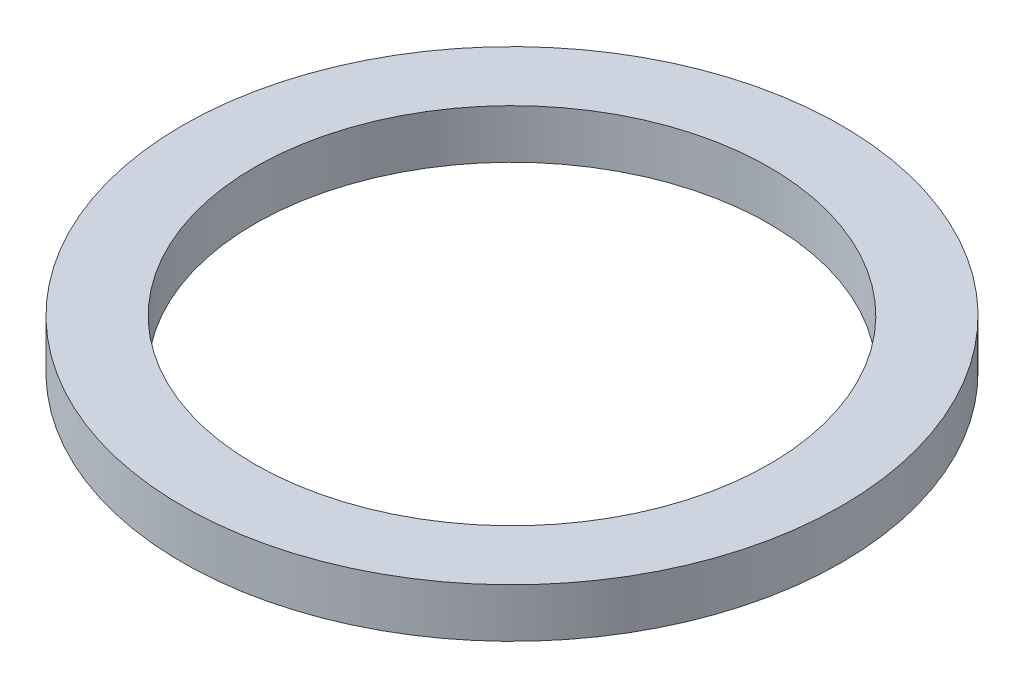
ISO-10303-21;
HEADER;
FILE_DESCRIPTION(('STEP AP214'),'2;1');
FILE_NAME('part.step','',(''),(''),'','','');
FILE_SCHEMA(('AUTOMOTIVE_DESIGN { 1 0 10303 214 1 1 1 1 }'));
ENDSEC;
DATA;
#1=APPLICATION_CONTEXT('core data for automotive mechanical design processes');
#2=APPLICATION_PROTOCOL_DEFINITION('international standard','automotive_design',2000,#1);
#3=PRODUCT_CONTEXT('',#1,'mechanical');
#4=PRODUCT('Part','Part','',(#3));
#5=PRODUCT_RELATED_PRODUCT_CATEGORY('part','',(#4));
#6=PRODUCT_DEFINITION_FORMATION('','',#4);
#7=PRODUCT_DEFINITION_CONTEXT('part definition',#1,'design');
#8=PRODUCT_DEFINITION('design','',#6,#7);
#9=PRODUCT_DEFINITION_SHAPE('','',#8);
#10=(LENGTH_UNIT() NAMED_UNIT(*) SI_UNIT(.MILLI.,.METRE.));
#11=(NAMED_UNIT(*) PLANE_ANGLE_UNIT() SI_UNIT($,.RADIAN.));
#12=(NAMED_UNIT(*) SI_UNIT($,.STERADIAN.) SOLID_ANGLE_UNIT());
#13=UNCERTAINTY_MEASURE_WITH_UNIT(LENGTH_MEASURE(1.E-05),#10,'distance_accuracy_value','');
#14=(GEOMETRIC_REPRESENTATION_CONTEXT(3) GLOBAL_UNCERTAINTY_ASSIGNED_CONTEXT((#13)) GLOBAL_UNIT_ASSIGNED_CONTEXT((#10,
#11,#12)) REPRESENTATION_CONTEXT('',''));
#15=CARTESIAN_POINT('',(0.,0.,0.));
#16=DIRECTION('',(0.,0.,1.));
#17=DIRECTION('',(1.,0.,0.));
#18=AXIS2_PLACEMENT_3D('',#15,#16,#17);
#19=CARTESIAN_POINT('',(0.,2.,0.));
#20=DIRECTION('',(0.,1.,0.));
#21=DIRECTION('',(0.,0.,1.));
#22=AXIS2_PLACEMENT_3D('',#19,#20,#21);
#23=PLANE('',#22);
#24=CARTESIAN_POINT('',(0.,2.,0.));
#25=DIRECTION('',(0.,1.,0.));
#26=DIRECTION('',(1.,0.,0.));
#27=AXIS2_PLACEMENT_3D('',#24,#25,#26);
#28=CIRCLE('',#27,13.45);
#29=CARTESIAN_POINT('',(13.45,2.,0.));
#30=VERTEX_POINT('',#29);
#31=EDGE_CURVE('E11',#30,#30,#28,.T.);
#32=ORIENTED_EDGE('',*,*,#31,.T.);
#33=EDGE_LOOP('',(#32));
#34=FACE_BOUND('',#33,.T.);
#35=CARTESIAN_POINT('',(0.,2.,0.));
#36=DIRECTION('',(0.,1.,0.));
#37=DIRECTION('',(0.,0.,1.));
#38=AXIS2_PLACEMENT_3D('',#35,#36,#37);
#39=CIRCLE('',#38,10.5);
#40=CARTESIAN_POINT('',(0.,2.,10.5));
#41=VERTEX_POINT('',#40);
#42=EDGE_CURVE('E48',#41,#41,#39,.T.);
#43=ORIENTED_EDGE('',*,*,#42,.F.);
#44=EDGE_LOOP('',(#43));
#45=FACE_BOUND('',#44,.T.);
#46=ADVANCED_FACE('F37',(#34,#45),#23,.T.);
#47=CARTESIAN_POINT('',(0.,0.,0.));
#48=DIRECTION('',(0.,1.,0.));
#49=DIRECTION('',(0.,0.,1.));
#50=AXIS2_PLACEMENT_3D('',#47,#48,#49);
#51=PLANE('',#50);
#52=CARTESIAN_POINT('',(0.,0.,0.));
#53=DIRECTION('',(0.,1.,0.));
#54=DIRECTION('',(1.,0.,0.));
#55=AXIS2_PLACEMENT_3D('',#52,#53,#54);
#56=CIRCLE('',#55,13.45);
#57=CARTESIAN_POINT('',(13.45,0.,0.));
#58=VERTEX_POINT('',#57);
#59=EDGE_CURVE('E41',#58,#58,#56,.T.);
#60=ORIENTED_EDGE('',*,*,#59,.F.);
#61=EDGE_LOOP('',(#60));
#62=FACE_BOUND('',#61,.T.);
#63=CARTESIAN_POINT('',(0.,0.,0.));
#64=DIRECTION('',(0.,1.,0.));
#65=DIRECTION('',(0.,0.,1.));
#66=AXIS2_PLACEMENT_3D('',#63,#64,#65);
#67=CIRCLE('',#66,10.5);
#68=CARTESIAN_POINT('',(0.,0.,10.5));
#69=VERTEX_POINT('',#68);
#70=EDGE_CURVE('E50',#69,#69,#67,.T.);
#71=ORIENTED_EDGE('',*,*,#70,.T.);
#72=EDGE_LOOP('',(#71));
#73=FACE_BOUND('',#72,.T.);
#74=ADVANCED_FACE('F60',(#62,#73),#51,.F.);
#75=CARTESIAN_POINT('',(0.,2.,0.));
#76=DIRECTION('',(0.,-1.,0.));
#77=DIRECTION('',(0.,0.,-1.));
#78=AXIS2_PLACEMENT_3D('',#75,#76,#77);
#79=CYLINDRICAL_SURFACE('',#78,13.45);
#80=ORIENTED_EDGE('',*,*,#31,.F.);
#81=EDGE_LOOP('',(#80));
#82=FACE_BOUND('',#81,.T.);
#83=ORIENTED_EDGE('',*,*,#59,.T.);
#84=EDGE_LOOP('',(#83));
#85=FACE_BOUND('',#84,.T.);
#86=ADVANCED_FACE('F39',(#82,#85),#79,.T.);
#87=CARTESIAN_POINT('',(0.,2.,0.));
#88=DIRECTION('',(0.,-1.,0.));
#89=DIRECTION('',(0.,0.,-1.));
#90=AXIS2_PLACEMENT_3D('',#87,#88,#89);
#91=CYLINDRICAL_SURFACE('',#90,10.5);
#92=ORIENTED_EDGE('',*,*,#42,.T.);
#93=EDGE_LOOP('',(#92));
#94=FACE_BOUND('',#93,.T.);
#95=ORIENTED_EDGE('',*,*,#70,.F.);
#96=EDGE_LOOP('',(#95));
#97=FACE_BOUND('',#96,.T.);
#98=ADVANCED_FACE('F56',(#94,#97),#91,.F.);
#99=CLOSED_SHELL('',(#46,#74,#86,#98));
#100=MANIFOLD_SOLID_BREP('B2',#99);
#101=ADVANCED_BREP_SHAPE_REPRESENTATION('',(#18,#100),#14);
#102=SHAPE_DEFINITION_REPRESENTATION(#9,#101);
ENDSEC;
END-ISO-10303-21;
